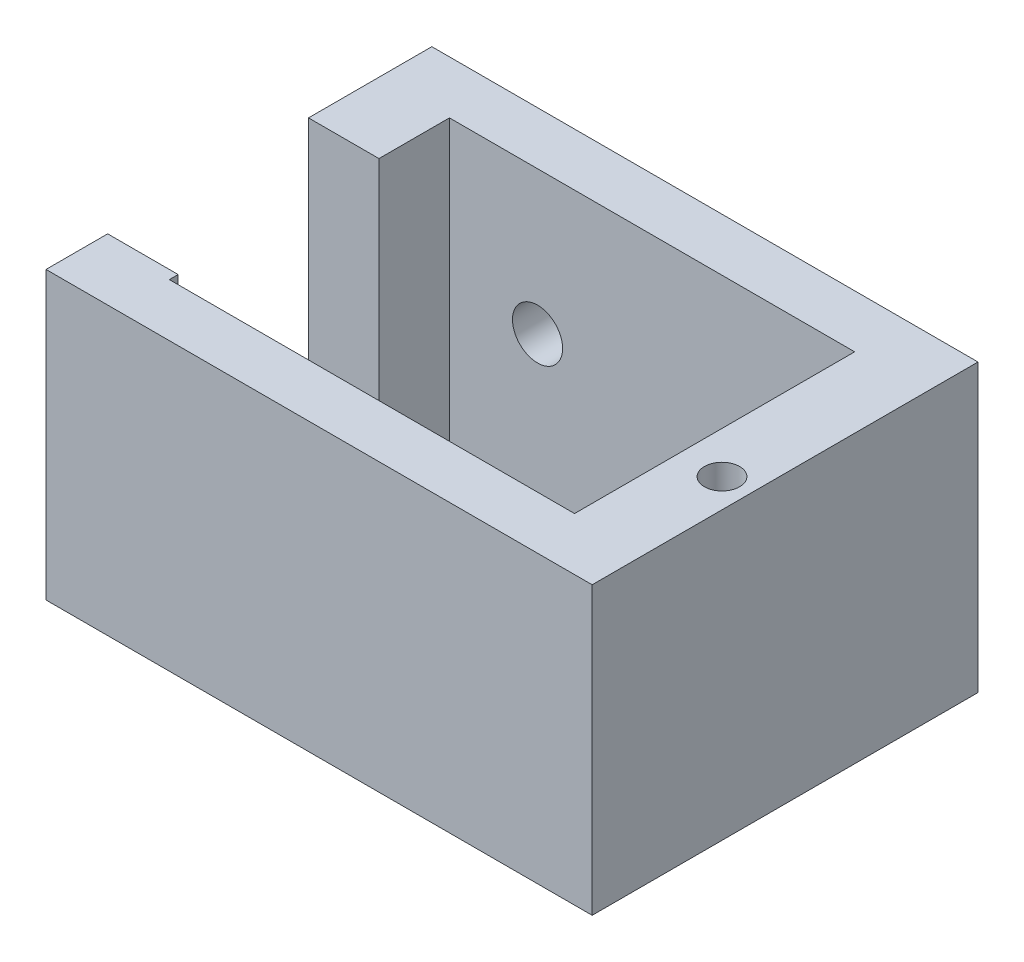
ISO-10303-21;
HEADER;
FILE_DESCRIPTION(('STEP AP214'),'2;1');
FILE_NAME('part.step','',(''),(''),'','','');
FILE_SCHEMA(('AUTOMOTIVE_DESIGN { 1 0 10303 214 1 1 1 1 }'));
ENDSEC;
DATA;
#1=APPLICATION_CONTEXT('core data for automotive mechanical design processes');
#2=APPLICATION_PROTOCOL_DEFINITION('international standard','automotive_design',2000,#1);
#3=PRODUCT_CONTEXT('',#1,'mechanical');
#4=PRODUCT('Part','Part','',(#3));
#5=PRODUCT_RELATED_PRODUCT_CATEGORY('part','',(#4));
#6=PRODUCT_DEFINITION_FORMATION('','',#4);
#7=PRODUCT_DEFINITION_CONTEXT('part definition',#1,'design');
#8=PRODUCT_DEFINITION('design','',#6,#7);
#9=PRODUCT_DEFINITION_SHAPE('','',#8);
#10=(LENGTH_UNIT() NAMED_UNIT(*) SI_UNIT(.MILLI.,.METRE.));
#11=(NAMED_UNIT(*) PLANE_ANGLE_UNIT() SI_UNIT($,.RADIAN.));
#12=(NAMED_UNIT(*) SI_UNIT($,.STERADIAN.) SOLID_ANGLE_UNIT());
#13=UNCERTAINTY_MEASURE_WITH_UNIT(LENGTH_MEASURE(1.E-05),#10,'distance_accuracy_value','');
#14=(GEOMETRIC_REPRESENTATION_CONTEXT(3) GLOBAL_UNCERTAINTY_ASSIGNED_CONTEXT((#13)) GLOBAL_UNIT_ASSIGNED_CONTEXT((#10,
#11,#12)) REPRESENTATION_CONTEXT('',''));
#15=CARTESIAN_POINT('',(0.,0.,0.));
#16=DIRECTION('',(0.,0.,1.));
#17=DIRECTION('',(1.,0.,0.));
#18=AXIS2_PLACEMENT_3D('',#15,#16,#17);
#19=CARTESIAN_POINT('',(15.5,16.25,10.95));
#20=DIRECTION('',(-1.,0.,0.));
#21=DIRECTION('',(0.,0.,1.));
#22=AXIS2_PLACEMENT_3D('',#19,#20,#21);
#23=PLANE('',#22);
#24=DIRECTION('',(0.,0.,-1.));
#25=VECTOR('',#24,1.);
#26=CARTESIAN_POINT('',(15.5,0.,10.95));
#27=LINE('',#26,#25);
#28=CARTESIAN_POINT('',(15.5,0.,10.95));
#29=VERTEX_POINT('',#28);
#30=CARTESIAN_POINT('',(15.5,0.,-10.95));
#31=VERTEX_POINT('',#30);
#32=EDGE_CURVE('E156',#29,#31,#27,.T.);
#33=ORIENTED_EDGE('',*,*,#32,.T.);
#34=DIRECTION('',(0.,-1.,0.));
#35=VECTOR('',#34,1.);
#36=CARTESIAN_POINT('',(15.5,16.25,-10.95));
#37=LINE('',#36,#35);
#38=CARTESIAN_POINT('',(15.5,16.25,-10.95));
#39=VERTEX_POINT('',#38);
#40=EDGE_CURVE('E192',#39,#31,#37,.T.);
#41=ORIENTED_EDGE('',*,*,#40,.F.);
#42=DIRECTION('',(0.,0.,-1.));
#43=VECTOR('',#42,1.);
#44=CARTESIAN_POINT('',(15.5,16.25,10.95));
#45=LINE('',#44,#43);
#46=CARTESIAN_POINT('',(15.5,16.25,10.95));
#47=VERTEX_POINT('',#46);
#48=EDGE_CURVE('E165',#47,#39,#45,.T.);
#49=ORIENTED_EDGE('',*,*,#48,.F.);
#50=DIRECTION('',(0.,-1.,0.));
#51=VECTOR('',#50,1.);
#52=CARTESIAN_POINT('',(15.5,16.25,10.95));
#53=LINE('',#52,#51);
#54=EDGE_CURVE('E176',#47,#29,#53,.T.);
#55=ORIENTED_EDGE('',*,*,#54,.T.);
#56=EDGE_LOOP('',(#33,#41,#49,#55));
#57=FACE_BOUND('',#56,.T.);
#58=ADVANCED_FACE('F33',(#57),#23,.F.);
#59=CARTESIAN_POINT('',(-15.5,16.25,-10.95));
#60=DIRECTION('',(0.,0.,1.));
#61=DIRECTION('',(1.,0.,0.));
#62=AXIS2_PLACEMENT_3D('',#59,#60,#61);
#63=PLANE('',#62);
#64=CARTESIAN_POINT('',(6.5,8.125,-10.95));
#65=DIRECTION('',(0.,0.,-1.));
#66=DIRECTION('',(-1.,0.,0.));
#67=AXIS2_PLACEMENT_3D('',#64,#65,#66);
#68=CIRCLE('',#67,1.4224);
#69=CARTESIAN_POINT('',(5.0776,8.125,-10.95));
#70=VERTEX_POINT('',#69);
#71=EDGE_CURVE('E199',#70,#70,#68,.T.);
#72=ORIENTED_EDGE('',*,*,#71,.F.);
#73=EDGE_LOOP('',(#72));
#74=FACE_BOUND('',#73,.T.);
#75=CARTESIAN_POINT('',(-6.5,8.125,-10.95));
#76=DIRECTION('',(0.,0.,-1.));
#77=DIRECTION('',(-1.,0.,0.));
#78=AXIS2_PLACEMENT_3D('',#75,#76,#77);
#79=CIRCLE('',#78,1.4224);
#80=CARTESIAN_POINT('',(-7.9224,8.125,-10.95));
#81=VERTEX_POINT('',#80);
#82=EDGE_CURVE('E216',#81,#81,#79,.T.);
#83=ORIENTED_EDGE('',*,*,#82,.F.);
#84=EDGE_LOOP('',(#83));
#85=FACE_BOUND('',#84,.T.);
#86=DIRECTION('',(-1.,0.,0.));
#87=VECTOR('',#86,1.);
#88=CARTESIAN_POINT('',(-15.5,0.,-10.95));
#89=LINE('',#88,#87);
#90=CARTESIAN_POINT('',(-15.5,0.,-10.95));
#91=VERTEX_POINT('',#90);
#92=EDGE_CURVE('E179',#31,#91,#89,.T.);
#93=ORIENTED_EDGE('',*,*,#92,.T.);
#94=DIRECTION('',(0.,-1.,0.));
#95=VECTOR('',#94,1.);
#96=CARTESIAN_POINT('',(-15.5,16.25,-10.95));
#97=LINE('',#96,#95);
#98=CARTESIAN_POINT('',(-15.5,16.25,-10.95));
#99=VERTEX_POINT('',#98);
#100=EDGE_CURVE('E189',#99,#91,#97,.T.);
#101=ORIENTED_EDGE('',*,*,#100,.F.);
#102=DIRECTION('',(-1.,0.,0.));
#103=VECTOR('',#102,1.);
#104=CARTESIAN_POINT('',(-15.5,16.25,-10.95));
#105=LINE('',#104,#103);
#106=EDGE_CURVE('E168',#39,#99,#105,.T.);
#107=ORIENTED_EDGE('',*,*,#106,.F.);
#108=ORIENTED_EDGE('',*,*,#40,.T.);
#109=EDGE_LOOP('',(#93,#101,#107,#108));
#110=FACE_BOUND('',#109,.T.);
#111=ADVANCED_FACE('F267',(#74,#85,#110),#63,.F.);
#112=CARTESIAN_POINT('',(-15.5,16.25,10.95));
#113=DIRECTION('',(1.,0.,0.));
#114=DIRECTION('',(0.,0.,-1.));
#115=AXIS2_PLACEMENT_3D('',#112,#113,#114);
#116=PLANE('',#115);
#117=DIRECTION('',(0.,-1.,0.));
#118=VECTOR('',#117,1.);
#119=CARTESIAN_POINT('',(-15.5,12.75,-3.95));
#120=LINE('',#119,#118);
#121=CARTESIAN_POINT('',(-15.5,16.25,-3.95));
#122=VERTEX_POINT('',#121);
#123=CARTESIAN_POINT('',(-15.5,3.5,-3.95));
#124=VERTEX_POINT('',#123);
#125=EDGE_CURVE('E47',#122,#124,#120,.T.);
#126=ORIENTED_EDGE('',*,*,#125,.F.);
#127=DIRECTION('',(0.,0.,1.));
#128=VECTOR('',#127,1.);
#129=CARTESIAN_POINT('',(-15.5,16.25,10.95));
#130=LINE('',#129,#128);
#131=EDGE_CURVE('E172',#99,#122,#130,.T.);
#132=ORIENTED_EDGE('',*,*,#131,.F.);
#133=ORIENTED_EDGE('',*,*,#100,.T.);
#134=DIRECTION('',(0.,0.,1.));
#135=VECTOR('',#134,1.);
#136=CARTESIAN_POINT('',(-15.5,0.,10.95));
#137=LINE('',#136,#135);
#138=CARTESIAN_POINT('',(-15.5,0.,10.95));
#139=VERTEX_POINT('',#138);
#140=EDGE_CURVE('E181',#91,#139,#137,.T.);
#141=ORIENTED_EDGE('',*,*,#140,.T.);
#142=DIRECTION('',(0.,-1.,0.));
#143=VECTOR('',#142,1.);
#144=CARTESIAN_POINT('',(-15.5,16.25,10.95));
#145=LINE('',#144,#143);
#146=CARTESIAN_POINT('',(-15.5,16.25,10.95));
#147=VERTEX_POINT('',#146);
#148=EDGE_CURVE('E186',#147,#139,#145,.T.);
#149=ORIENTED_EDGE('',*,*,#148,.F.);
#150=CARTESIAN_POINT('',(-15.5,16.25,7.45));
#151=VERTEX_POINT('',#150);
#152=EDGE_CURVE('E171',#151,#147,#130,.T.);
#153=ORIENTED_EDGE('',*,*,#152,.F.);
#154=DIRECTION('',(0.,1.,0.));
#155=VECTOR('',#154,1.);
#156=CARTESIAN_POINT('',(-15.5,12.75,7.45));
#157=LINE('',#156,#155);
#158=CARTESIAN_POINT('',(-15.5,3.5,7.45));
#159=VERTEX_POINT('',#158);
#160=EDGE_CURVE('E133',#159,#151,#157,.T.);
#161=ORIENTED_EDGE('',*,*,#160,.F.);
#162=DIRECTION('',(0.,0.,1.));
#163=VECTOR('',#162,1.);
#164=CARTESIAN_POINT('',(-15.5,3.5,-3.95));
#165=LINE('',#164,#163);
#166=EDGE_CURVE('E225',#124,#159,#165,.T.);
#167=ORIENTED_EDGE('',*,*,#166,.F.);
#168=EDGE_LOOP('',(#126,#132,#133,#141,#149,#153,#161,#167));
#169=FACE_BOUND('',#168,.T.);
#170=ADVANCED_FACE('F240',(#169),#116,.F.);
#171=CARTESIAN_POINT('',(-15.5,16.25,10.95));
#172=DIRECTION('',(0.,0.,-1.));
#173=DIRECTION('',(-1.,0.,0.));
#174=AXIS2_PLACEMENT_3D('',#171,#172,#173);
#175=PLANE('',#174);
#176=DIRECTION('',(1.,0.,0.));
#177=VECTOR('',#176,1.);
#178=CARTESIAN_POINT('',(-15.5,0.,10.95));
#179=LINE('',#178,#177);
#180=EDGE_CURVE('E169',#139,#29,#179,.T.);
#181=ORIENTED_EDGE('',*,*,#180,.T.);
#182=ORIENTED_EDGE('',*,*,#54,.F.);
#183=DIRECTION('',(1.,0.,0.));
#184=VECTOR('',#183,1.);
#185=CARTESIAN_POINT('',(-15.5,16.25,10.95));
#186=LINE('',#185,#184);
#187=EDGE_CURVE('E174',#147,#47,#186,.T.);
#188=ORIENTED_EDGE('',*,*,#187,.F.);
#189=ORIENTED_EDGE('',*,*,#148,.T.);
#190=EDGE_LOOP('',(#181,#182,#188,#189));
#191=FACE_BOUND('',#190,.T.);
#192=ADVANCED_FACE('F282',(#191),#175,.F.);
#193=CARTESIAN_POINT('',(0.,16.25,0.));
#194=DIRECTION('',(0.,-1.,0.));
#195=DIRECTION('',(0.,0.,-1.));
#196=AXIS2_PLACEMENT_3D('',#193,#194,#195);
#197=PLANE('',#196);
#198=CARTESIAN_POINT('',(13.87,16.25,1.95));
#199=DIRECTION('',(0.,1.,0.));
#200=DIRECTION('',(0.,0.,1.));
#201=AXIS2_PLACEMENT_3D('',#198,#199,#200);
#202=CIRCLE('',#201,1.);
#203=CARTESIAN_POINT('',(13.87,16.25,2.95));
#204=VERTEX_POINT('',#203);
#205=EDGE_CURVE('E229',#204,#204,#202,.T.);
#206=ORIENTED_EDGE('',*,*,#205,.F.);
#207=EDGE_LOOP('',(#206));
#208=FACE_BOUND('',#207,.T.);
#209=ORIENTED_EDGE('',*,*,#131,.T.);
#210=DIRECTION('',(-1.,0.,0.));
#211=VECTOR('',#210,1.);
#212=CARTESIAN_POINT('',(-11.5,16.25,-3.95));
#213=LINE('',#212,#211);
#214=CARTESIAN_POINT('',(-11.5,16.25,-3.95));
#215=VERTEX_POINT('',#214);
#216=EDGE_CURVE('E136',#215,#122,#213,.T.);
#217=ORIENTED_EDGE('',*,*,#216,.F.);
#218=DIRECTION('',(0.,0.,1.));
#219=VECTOR('',#218,1.);
#220=CARTESIAN_POINT('',(-11.5,16.25,7.95));
#221=LINE('',#220,#219);
#222=CARTESIAN_POINT('',(-11.5,16.25,-7.95));
#223=VERTEX_POINT('',#222);
#224=EDGE_CURVE('E144',#223,#215,#221,.T.);
#225=ORIENTED_EDGE('',*,*,#224,.F.);
#226=DIRECTION('',(-1.,0.,0.));
#227=VECTOR('',#226,1.);
#228=CARTESIAN_POINT('',(-11.5,16.25,-7.95));
#229=LINE('',#228,#227);
#230=CARTESIAN_POINT('',(11.5,16.25,-7.95));
#231=VERTEX_POINT('',#230);
#232=EDGE_CURVE('E145',#231,#223,#229,.T.);
#233=ORIENTED_EDGE('',*,*,#232,.F.);
#234=DIRECTION('',(0.,0.,-1.));
#235=VECTOR('',#234,1.);
#236=CARTESIAN_POINT('',(11.5,16.25,7.95));
#237=LINE('',#236,#235);
#238=CARTESIAN_POINT('',(11.5,16.25,7.95));
#239=VERTEX_POINT('',#238);
#240=EDGE_CURVE('E148',#239,#231,#237,.T.);
#241=ORIENTED_EDGE('',*,*,#240,.F.);
#242=DIRECTION('',(1.,0.,0.));
#243=VECTOR('',#242,1.);
#244=CARTESIAN_POINT('',(-11.5,16.25,7.95));
#245=LINE('',#244,#243);
#246=CARTESIAN_POINT('',(-11.5,16.25,7.95));
#247=VERTEX_POINT('',#246);
#248=EDGE_CURVE('E143',#247,#239,#245,.T.);
#249=ORIENTED_EDGE('',*,*,#248,.F.);
#250=CARTESIAN_POINT('',(-11.5,16.25,7.45));
#251=VERTEX_POINT('',#250);
#252=EDGE_CURVE('E125',#251,#247,#221,.T.);
#253=ORIENTED_EDGE('',*,*,#252,.F.);
#254=DIRECTION('',(-1.,0.,0.));
#255=VECTOR('',#254,1.);
#256=CARTESIAN_POINT('',(-11.5,16.25,7.45));
#257=LINE('',#256,#255);
#258=EDGE_CURVE('E130',#251,#151,#257,.T.);
#259=ORIENTED_EDGE('',*,*,#258,.T.);
#260=ORIENTED_EDGE('',*,*,#152,.T.);
#261=ORIENTED_EDGE('',*,*,#187,.T.);
#262=ORIENTED_EDGE('',*,*,#48,.T.);
#263=ORIENTED_EDGE('',*,*,#106,.T.);
#264=EDGE_LOOP('',(#209,#217,#225,#233,#241,#249,#253,#259,#260,#261,#262,#263));
#265=FACE_BOUND('',#264,.T.);
#266=ADVANCED_FACE('F140',(#208,#265),#197,.F.);
#267=CARTESIAN_POINT('',(0.,0.,0.));
#268=DIRECTION('',(0.,-1.,0.));
#269=DIRECTION('',(0.,0.,-1.));
#270=AXIS2_PLACEMENT_3D('',#267,#268,#269);
#271=PLANE('',#270);
#272=DIRECTION('',(0.,0.,-1.));
#273=VECTOR('',#272,1.);
#274=CARTESIAN_POINT('',(11.5,0.,7.95));
#275=LINE('',#274,#273);
#276=CARTESIAN_POINT('',(11.5,0.,7.95));
#277=VERTEX_POINT('',#276);
#278=CARTESIAN_POINT('',(11.5,0.,-7.95));
#279=VERTEX_POINT('',#278);
#280=EDGE_CURVE('E153',#277,#279,#275,.T.);
#281=ORIENTED_EDGE('',*,*,#280,.T.);
#282=DIRECTION('',(-1.,0.,0.));
#283=VECTOR('',#282,1.);
#284=CARTESIAN_POINT('',(-11.5,0.,-7.95));
#285=LINE('',#284,#283);
#286=CARTESIAN_POINT('',(-11.5,0.,-7.95));
#287=VERTEX_POINT('',#286);
#288=EDGE_CURVE('E211',#279,#287,#285,.T.);
#289=ORIENTED_EDGE('',*,*,#288,.T.);
#290=DIRECTION('',(0.,0.,1.));
#291=VECTOR('',#290,1.);
#292=CARTESIAN_POINT('',(-11.5,0.,7.95));
#293=LINE('',#292,#291);
#294=CARTESIAN_POINT('',(-11.5,0.,7.95));
#295=VERTEX_POINT('',#294);
#296=EDGE_CURVE('E208',#287,#295,#293,.T.);
#297=ORIENTED_EDGE('',*,*,#296,.T.);
#298=DIRECTION('',(1.,0.,0.));
#299=VECTOR('',#298,1.);
#300=CARTESIAN_POINT('',(-11.5,0.,7.95));
#301=LINE('',#300,#299);
#302=EDGE_CURVE('E164',#295,#277,#301,.T.);
#303=ORIENTED_EDGE('',*,*,#302,.T.);
#304=EDGE_LOOP('',(#281,#289,#297,#303));
#305=FACE_BOUND('',#304,.T.);
#306=ORIENTED_EDGE('',*,*,#32,.F.);
#307=ORIENTED_EDGE('',*,*,#180,.F.);
#308=ORIENTED_EDGE('',*,*,#140,.F.);
#309=ORIENTED_EDGE('',*,*,#92,.F.);
#310=EDGE_LOOP('',(#306,#307,#308,#309));
#311=FACE_BOUND('',#310,.T.);
#312=ADVANCED_FACE('F253',(#305,#311),#271,.T.);
#313=CARTESIAN_POINT('',(11.5,0.,7.95));
#314=DIRECTION('',(1.,0.,0.));
#315=DIRECTION('',(0.,0.,-1.));
#316=AXIS2_PLACEMENT_3D('',#313,#314,#315);
#317=PLANE('',#316);
#318=ORIENTED_EDGE('',*,*,#240,.T.);
#319=DIRECTION('',(0.,1.,0.));
#320=VECTOR('',#319,1.);
#321=CARTESIAN_POINT('',(11.5,0.,-7.95));
#322=LINE('',#321,#320);
#323=EDGE_CURVE('E161',#279,#231,#322,.T.);
#324=ORIENTED_EDGE('',*,*,#323,.F.);
#325=ORIENTED_EDGE('',*,*,#280,.F.);
#326=DIRECTION('',(0.,1.,0.));
#327=VECTOR('',#326,1.);
#328=CARTESIAN_POINT('',(11.5,0.,7.95));
#329=LINE('',#328,#327);
#330=EDGE_CURVE('E154',#277,#239,#329,.T.);
#331=ORIENTED_EDGE('',*,*,#330,.T.);
#332=EDGE_LOOP('',(#318,#324,#325,#331));
#333=FACE_BOUND('',#332,.T.);
#334=ADVANCED_FACE('F250',(#333),#317,.F.);
#335=CARTESIAN_POINT('',(-11.5,0.,7.95));
#336=DIRECTION('',(0.,0.,1.));
#337=DIRECTION('',(1.,0.,0.));
#338=AXIS2_PLACEMENT_3D('',#335,#336,#337);
#339=PLANE('',#338);
#340=ORIENTED_EDGE('',*,*,#248,.T.);
#341=ORIENTED_EDGE('',*,*,#330,.F.);
#342=ORIENTED_EDGE('',*,*,#302,.F.);
#343=DIRECTION('',(0.,1.,0.));
#344=VECTOR('',#343,1.);
#345=CARTESIAN_POINT('',(-11.5,0.,7.95));
#346=LINE('',#345,#344);
#347=EDGE_CURVE('E157',#295,#247,#346,.T.);
#348=ORIENTED_EDGE('',*,*,#347,.T.);
#349=EDGE_LOOP('',(#340,#341,#342,#348));
#350=FACE_BOUND('',#349,.T.);
#351=ADVANCED_FACE('F256',(#350),#339,.F.);
#352=CARTESIAN_POINT('',(-11.5,0.,7.95));
#353=DIRECTION('',(-1.,0.,0.));
#354=DIRECTION('',(0.,0.,1.));
#355=AXIS2_PLACEMENT_3D('',#352,#353,#354);
#356=PLANE('',#355);
#357=ORIENTED_EDGE('',*,*,#224,.T.);
#358=DIRECTION('',(0.,-1.,0.));
#359=VECTOR('',#358,1.);
#360=CARTESIAN_POINT('',(-11.5,0.,-3.95));
#361=LINE('',#360,#359);
#362=CARTESIAN_POINT('',(-11.5,3.5,-3.95));
#363=VERTEX_POINT('',#362);
#364=EDGE_CURVE('E11',#215,#363,#361,.T.);
#365=ORIENTED_EDGE('',*,*,#364,.T.);
#366=DIRECTION('',(0.,0.,1.));
#367=VECTOR('',#366,1.);
#368=CARTESIAN_POINT('',(-11.5,3.5,7.95));
#369=LINE('',#368,#367);
#370=CARTESIAN_POINT('',(-11.5,3.5,7.45));
#371=VERTEX_POINT('',#370);
#372=EDGE_CURVE('E127',#363,#371,#369,.T.);
#373=ORIENTED_EDGE('',*,*,#372,.T.);
#374=DIRECTION('',(0.,1.,0.));
#375=VECTOR('',#374,1.);
#376=CARTESIAN_POINT('',(-11.5,0.,7.45));
#377=LINE('',#376,#375);
#378=EDGE_CURVE('E40',#371,#251,#377,.T.);
#379=ORIENTED_EDGE('',*,*,#378,.T.);
#380=ORIENTED_EDGE('',*,*,#252,.T.);
#381=ORIENTED_EDGE('',*,*,#347,.F.);
#382=ORIENTED_EDGE('',*,*,#296,.F.);
#383=DIRECTION('',(0.,1.,0.));
#384=VECTOR('',#383,1.);
#385=CARTESIAN_POINT('',(-11.5,0.,-7.95));
#386=LINE('',#385,#384);
#387=EDGE_CURVE('E159',#287,#223,#386,.T.);
#388=ORIENTED_EDGE('',*,*,#387,.T.);
#389=EDGE_LOOP('',(#357,#365,#373,#379,#380,#381,#382,#388));
#390=FACE_BOUND('',#389,.T.);
#391=ADVANCED_FACE('F123',(#390),#356,.F.);
#392=CARTESIAN_POINT('',(-11.5,0.,-7.95));
#393=DIRECTION('',(0.,0.,-1.));
#394=DIRECTION('',(-1.,0.,0.));
#395=AXIS2_PLACEMENT_3D('',#392,#393,#394);
#396=PLANE('',#395);
#397=CARTESIAN_POINT('',(6.5,8.125,-7.95));
#398=DIRECTION('',(0.,0.,-1.));
#399=DIRECTION('',(-1.,0.,0.));
#400=AXIS2_PLACEMENT_3D('',#397,#398,#399);
#401=CIRCLE('',#400,1.4224);
#402=CARTESIAN_POINT('',(5.0776,8.125,-7.95));
#403=VERTEX_POINT('',#402);
#404=EDGE_CURVE('E198',#403,#403,#401,.T.);
#405=ORIENTED_EDGE('',*,*,#404,.T.);
#406=EDGE_LOOP('',(#405));
#407=FACE_BOUND('',#406,.T.);
#408=CARTESIAN_POINT('',(-6.5,8.125,-7.95));
#409=DIRECTION('',(0.,0.,-1.));
#410=DIRECTION('',(-1.,0.,0.));
#411=AXIS2_PLACEMENT_3D('',#408,#409,#410);
#412=CIRCLE('',#411,1.4224);
#413=CARTESIAN_POINT('',(-7.9224,8.125,-7.95));
#414=VERTEX_POINT('',#413);
#415=EDGE_CURVE('E195',#414,#414,#412,.T.);
#416=ORIENTED_EDGE('',*,*,#415,.T.);
#417=EDGE_LOOP('',(#416));
#418=FACE_BOUND('',#417,.T.);
#419=ORIENTED_EDGE('',*,*,#232,.T.);
#420=ORIENTED_EDGE('',*,*,#387,.F.);
#421=ORIENTED_EDGE('',*,*,#288,.F.);
#422=ORIENTED_EDGE('',*,*,#323,.T.);
#423=EDGE_LOOP('',(#419,#420,#421,#422));
#424=FACE_BOUND('',#423,.T.);
#425=ADVANCED_FACE('F247',(#407,#418,#424),#396,.F.);
#426=CARTESIAN_POINT('',(-6.5,8.125,-0.950000000000001));
#427=DIRECTION('',(0.,0.,-1.));
#428=DIRECTION('',(-1.,0.,0.));
#429=AXIS2_PLACEMENT_3D('',#426,#427,#428);
#430=CYLINDRICAL_SURFACE('',#429,1.4224);
#431=ORIENTED_EDGE('',*,*,#82,.T.);
#432=EDGE_LOOP('',(#431));
#433=FACE_BOUND('',#432,.T.);
#434=ORIENTED_EDGE('',*,*,#415,.F.);
#435=EDGE_LOOP('',(#434));
#436=FACE_BOUND('',#435,.T.);
#437=ADVANCED_FACE('F296',(#433,#436),#430,.F.);
#438=CARTESIAN_POINT('',(6.5,8.125,-0.950000000000001));
#439=DIRECTION('',(0.,0.,-1.));
#440=DIRECTION('',(-1.,0.,0.));
#441=AXIS2_PLACEMENT_3D('',#438,#439,#440);
#442=CYLINDRICAL_SURFACE('',#441,1.4224);
#443=ORIENTED_EDGE('',*,*,#71,.T.);
#444=EDGE_LOOP('',(#443));
#445=FACE_BOUND('',#444,.T.);
#446=ORIENTED_EDGE('',*,*,#404,.F.);
#447=EDGE_LOOP('',(#446));
#448=FACE_BOUND('',#447,.T.);
#449=ADVANCED_FACE('F300',(#445,#448),#442,.F.);
#450=CARTESIAN_POINT('',(-5.5,12.75,-3.95));
#451=DIRECTION('',(0.,0.,-1.));
#452=DIRECTION('',(0.,1.,0.));
#453=AXIS2_PLACEMENT_3D('',#450,#451,#452);
#454=PLANE('',#453);
#455=ORIENTED_EDGE('',*,*,#364,.F.);
#456=ORIENTED_EDGE('',*,*,#216,.T.);
#457=ORIENTED_EDGE('',*,*,#125,.T.);
#458=DIRECTION('',(-1.,0.,0.));
#459=VECTOR('',#458,1.);
#460=CARTESIAN_POINT('',(-5.5,3.5,-3.95));
#461=LINE('',#460,#459);
#462=EDGE_CURVE('E221',#363,#124,#461,.T.);
#463=ORIENTED_EDGE('',*,*,#462,.F.);
#464=EDGE_LOOP('',(#455,#456,#457,#463));
#465=FACE_BOUND('',#464,.T.);
#466=ADVANCED_FACE('F235',(#465),#454,.F.);
#467=CARTESIAN_POINT('',(-5.5,12.75,7.45));
#468=DIRECTION('',(0.,0.,1.));
#469=DIRECTION('',(0.,-1.,0.));
#470=AXIS2_PLACEMENT_3D('',#467,#468,#469);
#471=PLANE('',#470);
#472=DIRECTION('',(-1.,0.,0.));
#473=VECTOR('',#472,1.);
#474=CARTESIAN_POINT('',(-5.5,3.5,7.45));
#475=LINE('',#474,#473);
#476=EDGE_CURVE('E55',#371,#159,#475,.T.);
#477=ORIENTED_EDGE('',*,*,#476,.T.);
#478=ORIENTED_EDGE('',*,*,#160,.T.);
#479=ORIENTED_EDGE('',*,*,#258,.F.);
#480=ORIENTED_EDGE('',*,*,#378,.F.);
#481=EDGE_LOOP('',(#477,#478,#479,#480));
#482=FACE_BOUND('',#481,.T.);
#483=ADVANCED_FACE('F131',(#482),#471,.F.);
#484=CARTESIAN_POINT('',(-5.5,3.5,-3.95));
#485=DIRECTION('',(0.,-1.,0.));
#486=DIRECTION('',(0.,0.,-1.));
#487=AXIS2_PLACEMENT_3D('',#484,#485,#486);
#488=PLANE('',#487);
#489=ORIENTED_EDGE('',*,*,#462,.T.);
#490=ORIENTED_EDGE('',*,*,#166,.T.);
#491=ORIENTED_EDGE('',*,*,#476,.F.);
#492=ORIENTED_EDGE('',*,*,#372,.F.);
#493=EDGE_LOOP('',(#489,#490,#491,#492));
#494=FACE_BOUND('',#493,.T.);
#495=ADVANCED_FACE('F243',(#494),#488,.F.);
#496=CARTESIAN_POINT('',(13.87,6.25,1.95));
#497=DIRECTION('',(0.,1.,0.));
#498=DIRECTION('',(0.,0.,1.));
#499=AXIS2_PLACEMENT_3D('',#496,#497,#498);
#500=CYLINDRICAL_SURFACE('',#499,1.);
#501=CARTESIAN_POINT('',(13.87,6.25,1.95));
#502=DIRECTION('',(0.,1.,0.));
#503=DIRECTION('',(0.,0.,1.));
#504=AXIS2_PLACEMENT_3D('',#501,#502,#503);
#505=CIRCLE('',#504,1.);
#506=CARTESIAN_POINT('',(13.87,6.25,2.95));
#507=VERTEX_POINT('',#506);
#508=EDGE_CURVE('E228',#507,#507,#505,.T.);
#509=ORIENTED_EDGE('',*,*,#508,.F.);
#510=EDGE_LOOP('',(#509));
#511=FACE_BOUND('',#510,.T.);
#512=ORIENTED_EDGE('',*,*,#205,.T.);
#513=EDGE_LOOP('',(#512));
#514=FACE_BOUND('',#513,.T.);
#515=ADVANCED_FACE('F315',(#511,#514),#500,.F.);
#516=CARTESIAN_POINT('',(13.87,6.25,1.95));
#517=DIRECTION('',(0.,1.,0.));
#518=DIRECTION('',(0.,0.,1.));
#519=AXIS2_PLACEMENT_3D('',#516,#517,#518);
#520=PLANE('',#519);
#521=ORIENTED_EDGE('',*,*,#508,.T.);
#522=EDGE_LOOP('',(#521));
#523=FACE_BOUND('',#522,.T.);
#524=ADVANCED_FACE('F320',(#523),#520,.T.);
#525=CLOSED_SHELL('',(#58,#111,#170,#192,#266,#312,#334,#351,#391,#425,#437,#449,#466,#483,#495,
#515,#524));
#526=MANIFOLD_SOLID_BREP('B2',#525);
#527=ADVANCED_BREP_SHAPE_REPRESENTATION('',(#18,#526),#14);
#528=SHAPE_DEFINITION_REPRESENTATION(#9,#527);
ENDSEC;
END-ISO-10303-21;
